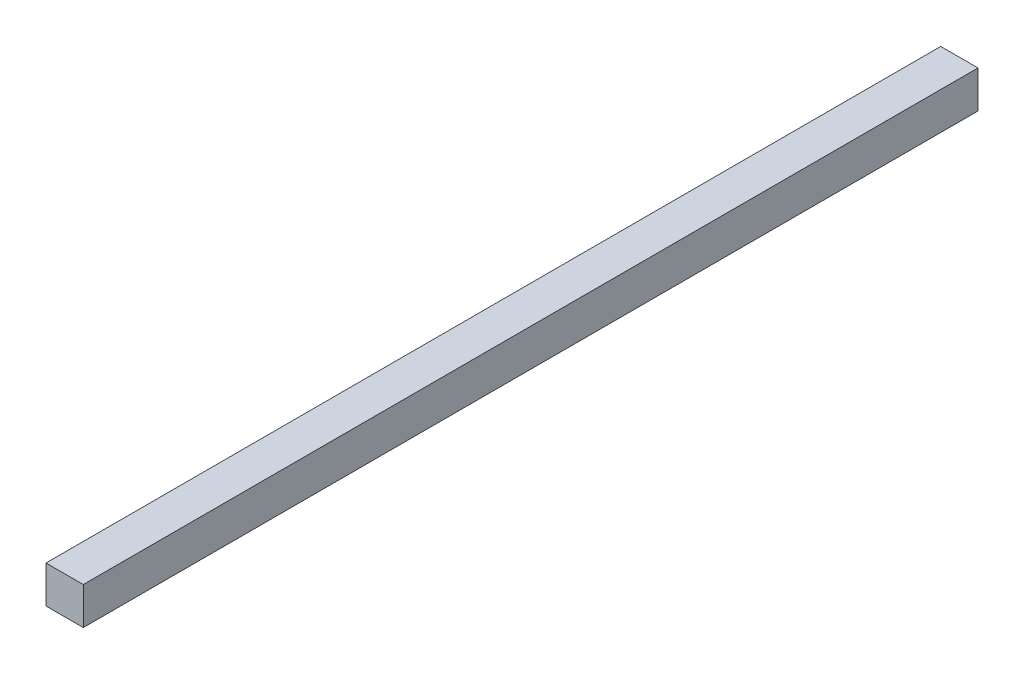
ISO-10303-21;
HEADER;
FILE_DESCRIPTION(('STEP AP214'),'2;1');
FILE_NAME('part.step','',(''),(''),'','','');
FILE_SCHEMA(('AUTOMOTIVE_DESIGN { 1 0 10303 214 1 1 1 1 }'));
ENDSEC;
DATA;
#1=APPLICATION_CONTEXT('core data for automotive mechanical design processes');
#2=APPLICATION_PROTOCOL_DEFINITION('international standard','automotive_design',2000,#1);
#3=PRODUCT_CONTEXT('',#1,'mechanical');
#4=PRODUCT('Part','Part','',(#3));
#5=PRODUCT_RELATED_PRODUCT_CATEGORY('part','',(#4));
#6=PRODUCT_DEFINITION_FORMATION('','',#4);
#7=PRODUCT_DEFINITION_CONTEXT('part definition',#1,'design');
#8=PRODUCT_DEFINITION('design','',#6,#7);
#9=PRODUCT_DEFINITION_SHAPE('','',#8);
#10=(LENGTH_UNIT() NAMED_UNIT(*) SI_UNIT(.MILLI.,.METRE.));
#11=(NAMED_UNIT(*) PLANE_ANGLE_UNIT() SI_UNIT($,.RADIAN.));
#12=(NAMED_UNIT(*) SI_UNIT($,.STERADIAN.) SOLID_ANGLE_UNIT());
#13=UNCERTAINTY_MEASURE_WITH_UNIT(LENGTH_MEASURE(1.E-05),#10,'distance_accuracy_value','');
#14=(GEOMETRIC_REPRESENTATION_CONTEXT(3) GLOBAL_UNCERTAINTY_ASSIGNED_CONTEXT((#13)) GLOBAL_UNIT_ASSIGNED_CONTEXT((#10,
#11,#12)) REPRESENTATION_CONTEXT('',''));
#15=CARTESIAN_POINT('',(0.,0.,0.));
#16=DIRECTION('',(0.,0.,1.));
#17=DIRECTION('',(1.,0.,0.));
#18=AXIS2_PLACEMENT_3D('',#15,#16,#17);
#19=CARTESIAN_POINT('',(3.175,3.175,152.4));
#20=DIRECTION('',(-1.,0.,0.));
#21=DIRECTION('',(0.,-1.,0.));
#22=AXIS2_PLACEMENT_3D('',#19,#20,#21);
#23=PLANE('',#22);
#24=DIRECTION('',(0.,1.,0.));
#25=VECTOR('',#24,1.);
#26=CARTESIAN_POINT('',(3.175,3.175,0.));
#27=LINE('',#26,#25);
#28=CARTESIAN_POINT('',(3.175,-3.175,0.));
#29=VERTEX_POINT('',#28);
#30=CARTESIAN_POINT('',(3.175,3.175,0.));
#31=VERTEX_POINT('',#30);
#32=EDGE_CURVE('E107',#29,#31,#27,.T.);
#33=ORIENTED_EDGE('',*,*,#32,.T.);
#34=DIRECTION('',(0.,0.,-1.));
#35=VECTOR('',#34,1.);
#36=CARTESIAN_POINT('',(3.175,3.175,152.4));
#37=LINE('',#36,#35);
#38=CARTESIAN_POINT('',(3.175,3.175,152.4));
#39=VERTEX_POINT('',#38);
#40=EDGE_CURVE('E11',#39,#31,#37,.T.);
#41=ORIENTED_EDGE('',*,*,#40,.F.);
#42=DIRECTION('',(0.,1.,0.));
#43=VECTOR('',#42,1.);
#44=CARTESIAN_POINT('',(3.175,3.175,152.4));
#45=LINE('',#44,#43);
#46=CARTESIAN_POINT('',(3.175,-3.175,152.4));
#47=VERTEX_POINT('',#46);
#48=EDGE_CURVE('E91',#47,#39,#45,.T.);
#49=ORIENTED_EDGE('',*,*,#48,.F.);
#50=DIRECTION('',(0.,0.,-1.));
#51=VECTOR('',#50,1.);
#52=CARTESIAN_POINT('',(3.175,-3.175,152.4));
#53=LINE('',#52,#51);
#54=EDGE_CURVE('E103',#47,#29,#53,.T.);
#55=ORIENTED_EDGE('',*,*,#54,.T.);
#56=EDGE_LOOP('',(#33,#41,#49,#55));
#57=FACE_BOUND('',#56,.T.);
#58=ADVANCED_FACE('F39',(#57),#23,.F.);
#59=CARTESIAN_POINT('',(-3.175,3.175,152.4));
#60=DIRECTION('',(0.,-1.,0.));
#61=DIRECTION('',(0.,0.,-1.));
#62=AXIS2_PLACEMENT_3D('',#59,#60,#61);
#63=PLANE('',#62);
#64=DIRECTION('',(-1.,0.,0.));
#65=VECTOR('',#64,1.);
#66=CARTESIAN_POINT('',(-3.175,3.175,0.));
#67=LINE('',#66,#65);
#68=CARTESIAN_POINT('',(-3.175,3.175,0.));
#69=VERTEX_POINT('',#68);
#70=EDGE_CURVE('E96',#31,#69,#67,.T.);
#71=ORIENTED_EDGE('',*,*,#70,.T.);
#72=DIRECTION('',(0.,0.,-1.));
#73=VECTOR('',#72,1.);
#74=CARTESIAN_POINT('',(-3.175,3.175,152.4));
#75=LINE('',#74,#73);
#76=CARTESIAN_POINT('',(-3.175,3.175,152.4));
#77=VERTEX_POINT('',#76);
#78=EDGE_CURVE('E48',#77,#69,#75,.T.);
#79=ORIENTED_EDGE('',*,*,#78,.F.);
#80=DIRECTION('',(-1.,0.,0.));
#81=VECTOR('',#80,1.);
#82=CARTESIAN_POINT('',(-3.175,3.175,152.4));
#83=LINE('',#82,#81);
#84=EDGE_CURVE('E86',#39,#77,#83,.T.);
#85=ORIENTED_EDGE('',*,*,#84,.F.);
#86=ORIENTED_EDGE('',*,*,#40,.T.);
#87=EDGE_LOOP('',(#71,#79,#85,#86));
#88=FACE_BOUND('',#87,.T.);
#89=ADVANCED_FACE('F95',(#88),#63,.F.);
#90=CARTESIAN_POINT('',(-3.175,3.175,152.4));
#91=DIRECTION('',(1.,0.,0.));
#92=DIRECTION('',(0.,1.,0.));
#93=AXIS2_PLACEMENT_3D('',#90,#91,#92);
#94=PLANE('',#93);
#95=DIRECTION('',(0.,-1.,0.));
#96=VECTOR('',#95,1.);
#97=CARTESIAN_POINT('',(-3.175,3.175,0.));
#98=LINE('',#97,#96);
#99=CARTESIAN_POINT('',(-3.175,-3.175,0.));
#100=VERTEX_POINT('',#99);
#101=EDGE_CURVE('E73',#69,#100,#98,.T.);
#102=ORIENTED_EDGE('',*,*,#101,.T.);
#103=DIRECTION('',(0.,0.,-1.));
#104=VECTOR('',#103,1.);
#105=CARTESIAN_POINT('',(-3.175,-3.175,152.4));
#106=LINE('',#105,#104);
#107=CARTESIAN_POINT('',(-3.175,-3.175,152.4));
#108=VERTEX_POINT('',#107);
#109=EDGE_CURVE('E98',#108,#100,#106,.T.);
#110=ORIENTED_EDGE('',*,*,#109,.F.);
#111=DIRECTION('',(0.,-1.,0.));
#112=VECTOR('',#111,1.);
#113=CARTESIAN_POINT('',(-3.175,3.175,152.4));
#114=LINE('',#113,#112);
#115=EDGE_CURVE('E89',#77,#108,#114,.T.);
#116=ORIENTED_EDGE('',*,*,#115,.F.);
#117=ORIENTED_EDGE('',*,*,#78,.T.);
#118=EDGE_LOOP('',(#102,#110,#116,#117));
#119=FACE_BOUND('',#118,.T.);
#120=ADVANCED_FACE('F99',(#119),#94,.F.);
#121=CARTESIAN_POINT('',(-3.175,-3.175,152.4));
#122=DIRECTION('',(0.,1.,0.));
#123=DIRECTION('',(0.,0.,1.));
#124=AXIS2_PLACEMENT_3D('',#121,#122,#123);
#125=PLANE('',#124);
#126=DIRECTION('',(1.,0.,0.));
#127=VECTOR('',#126,1.);
#128=CARTESIAN_POINT('',(-3.175,-3.175,0.));
#129=LINE('',#128,#127);
#130=EDGE_CURVE('E79',#100,#29,#129,.T.);
#131=ORIENTED_EDGE('',*,*,#130,.T.);
#132=ORIENTED_EDGE('',*,*,#54,.F.);
#133=DIRECTION('',(1.,0.,0.));
#134=VECTOR('',#133,1.);
#135=CARTESIAN_POINT('',(-3.175,-3.175,152.4));
#136=LINE('',#135,#134);
#137=EDGE_CURVE('E56',#108,#47,#136,.T.);
#138=ORIENTED_EDGE('',*,*,#137,.F.);
#139=ORIENTED_EDGE('',*,*,#109,.T.);
#140=EDGE_LOOP('',(#131,#132,#138,#139));
#141=FACE_BOUND('',#140,.T.);
#142=ADVANCED_FACE('F120',(#141),#125,.F.);
#143=CARTESIAN_POINT('',(0.,0.,152.4));
#144=DIRECTION('',(0.,0.,1.));
#145=DIRECTION('',(1.,0.,0.));
#146=AXIS2_PLACEMENT_3D('',#143,#144,#145);
#147=PLANE('',#146);
#148=ORIENTED_EDGE('',*,*,#48,.T.);
#149=ORIENTED_EDGE('',*,*,#84,.T.);
#150=ORIENTED_EDGE('',*,*,#115,.T.);
#151=ORIENTED_EDGE('',*,*,#137,.T.);
#152=EDGE_LOOP('',(#148,#149,#150,#151));
#153=FACE_BOUND('',#152,.T.);
#154=ADVANCED_FACE('F87',(#153),#147,.T.);
#155=CARTESIAN_POINT('',(0.,0.,0.));
#156=DIRECTION('',(0.,0.,1.));
#157=DIRECTION('',(1.,0.,0.));
#158=AXIS2_PLACEMENT_3D('',#155,#156,#157);
#159=PLANE('',#158);
#160=ORIENTED_EDGE('',*,*,#32,.F.);
#161=ORIENTED_EDGE('',*,*,#130,.F.);
#162=ORIENTED_EDGE('',*,*,#101,.F.);
#163=ORIENTED_EDGE('',*,*,#70,.F.);
#164=EDGE_LOOP('',(#160,#161,#162,#163));
#165=FACE_BOUND('',#164,.T.);
#166=ADVANCED_FACE('F123',(#165),#159,.F.);
#167=CLOSED_SHELL('',(#58,#89,#120,#142,#154,#166));
#168=MANIFOLD_SOLID_BREP('B2',#167);
#169=ADVANCED_BREP_SHAPE_REPRESENTATION('',(#18,#168),#14);
#170=SHAPE_DEFINITION_REPRESENTATION(#9,#169);
ENDSEC;
END-ISO-10303-21;
